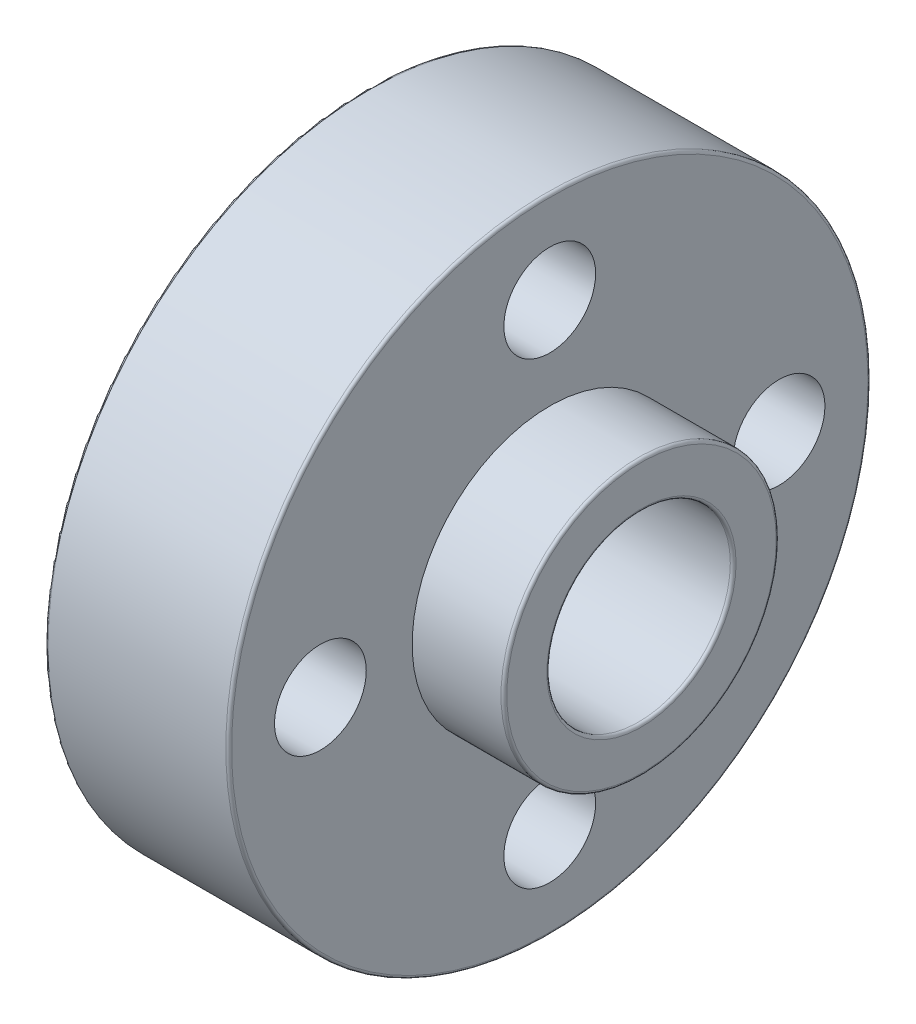
ISO-10303-21;
HEADER;
FILE_DESCRIPTION(('STEP AP214'),'2;1');
FILE_NAME('part.step','',(''),(''),'','','');
FILE_SCHEMA(('AUTOMOTIVE_DESIGN { 1 0 10303 214 1 1 1 1 }'));
ENDSEC;
DATA;
#1=APPLICATION_CONTEXT('core data for automotive mechanical design processes');
#2=APPLICATION_PROTOCOL_DEFINITION('international standard','automotive_design',2000,#1);
#3=PRODUCT_CONTEXT('',#1,'mechanical');
#4=PRODUCT('Part','Part','',(#3));
#5=PRODUCT_RELATED_PRODUCT_CATEGORY('part','',(#4));
#6=PRODUCT_DEFINITION_FORMATION('','',#4);
#7=PRODUCT_DEFINITION_CONTEXT('part definition',#1,'design');
#8=PRODUCT_DEFINITION('design','',#6,#7);
#9=PRODUCT_DEFINITION_SHAPE('','',#8);
#10=(LENGTH_UNIT() NAMED_UNIT(*) SI_UNIT(.MILLI.,.METRE.));
#11=(NAMED_UNIT(*) PLANE_ANGLE_UNIT() SI_UNIT($,.RADIAN.));
#12=(NAMED_UNIT(*) SI_UNIT($,.STERADIAN.) SOLID_ANGLE_UNIT());
#13=UNCERTAINTY_MEASURE_WITH_UNIT(LENGTH_MEASURE(1.E-05),#10,'distance_accuracy_value','');
#14=(GEOMETRIC_REPRESENTATION_CONTEXT(3) GLOBAL_UNCERTAINTY_ASSIGNED_CONTEXT((#13)) GLOBAL_UNIT_ASSIGNED_CONTEXT((#10,
#11,#12)) REPRESENTATION_CONTEXT('',''));
#15=CARTESIAN_POINT('',(0.,0.,0.));
#16=DIRECTION('',(0.,0.,1.));
#17=DIRECTION('',(1.,0.,0.));
#18=AXIS2_PLACEMENT_3D('',#15,#16,#17);
#19=CARTESIAN_POINT('',(-3.175,0.,0.));
#20=DIRECTION('',(1.,0.,0.));
#21=DIRECTION('',(0.,0.,-1.));
#22=AXIS2_PLACEMENT_3D('',#19,#20,#21);
#23=CYLINDRICAL_SURFACE('',#22,11.1125);
#24=CARTESIAN_POINT('',(-0.0999999999999998,0.,0.));
#25=DIRECTION('',(1.,0.,0.));
#26=DIRECTION('',(0.,0.,-1.));
#27=AXIS2_PLACEMENT_3D('',#24,#25,#26);
#28=CIRCLE('',#27,11.1125);
#29=CARTESIAN_POINT('',(-0.0999999999999998,0.,-11.1125));
#30=VERTEX_POINT('',#29);
#31=EDGE_CURVE('E53',#30,#30,#28,.F.);
#32=ORIENTED_EDGE('',*,*,#31,.T.);
#33=EDGE_LOOP('',(#32));
#34=FACE_BOUND('',#33,.T.);
#35=CARTESIAN_POINT('',(-6.25,0.,0.));
#36=DIRECTION('',(-1.,0.,0.));
#37=DIRECTION('',(0.,0.,1.));
#38=AXIS2_PLACEMENT_3D('',#35,#36,#37);
#39=CIRCLE('',#38,11.1125);
#40=CARTESIAN_POINT('',(-6.25,0.,11.1125));
#41=VERTEX_POINT('',#40);
#42=EDGE_CURVE('E56',#41,#41,#39,.F.);
#43=ORIENTED_EDGE('',*,*,#42,.T.);
#44=EDGE_LOOP('',(#43));
#45=FACE_BOUND('',#44,.T.);
#46=ADVANCED_FACE('F33',(#34,#45),#23,.T.);
#47=CARTESIAN_POINT('',(0.,0.,0.));
#48=DIRECTION('',(1.,0.,0.));
#49=DIRECTION('',(0.,0.,-1.));
#50=AXIS2_PLACEMENT_3D('',#47,#48,#49);
#51=PLANE('',#50);
#52=CARTESIAN_POINT('',(0.,0.,0.));
#53=DIRECTION('',(1.,0.,0.));
#54=DIRECTION('',(0.,0.,-1.));
#55=AXIS2_PLACEMENT_3D('',#52,#53,#54);
#56=CIRCLE('',#55,11.0125);
#57=CARTESIAN_POINT('',(0.,0.,-11.0125));
#58=VERTEX_POINT('',#57);
#59=EDGE_CURVE('E59',#58,#58,#56,.T.);
#60=ORIENTED_EDGE('',*,*,#59,.T.);
#61=EDGE_LOOP('',(#60));
#62=FACE_BOUND('',#61,.T.);
#63=CARTESIAN_POINT('',(0.,0.,-7.9375));
#64=DIRECTION('',(1.,0.,0.));
#65=DIRECTION('',(0.,0.,-1.));
#66=AXIS2_PLACEMENT_3D('',#63,#64,#65);
#67=CIRCLE('',#66,1.5875);
#68=CARTESIAN_POINT('',(0.,0.,-9.525));
#69=VERTEX_POINT('',#68);
#70=EDGE_CURVE('E91',#69,#69,#67,.T.);
#71=ORIENTED_EDGE('',*,*,#70,.F.);
#72=EDGE_LOOP('',(#71));
#73=FACE_BOUND('',#72,.T.);
#74=CARTESIAN_POINT('',(0.,-7.9375,0.));
#75=DIRECTION('',(1.,0.,0.));
#76=DIRECTION('',(0.,0.,-1.));
#77=AXIS2_PLACEMENT_3D('',#74,#75,#76);
#78=CIRCLE('',#77,1.5875);
#79=CARTESIAN_POINT('',(0.,-7.9375,-1.58749999999997));
#80=VERTEX_POINT('',#79);
#81=EDGE_CURVE('E102',#80,#80,#78,.T.);
#82=ORIENTED_EDGE('',*,*,#81,.F.);
#83=EDGE_LOOP('',(#82));
#84=FACE_BOUND('',#83,.T.);
#85=CARTESIAN_POINT('',(0.,0.,7.9375));
#86=DIRECTION('',(1.,0.,0.));
#87=DIRECTION('',(0.,0.,-1.));
#88=AXIS2_PLACEMENT_3D('',#85,#86,#87);
#89=CIRCLE('',#88,1.5875);
#90=CARTESIAN_POINT('',(0.,0.,6.35));
#91=VERTEX_POINT('',#90);
#92=EDGE_CURVE('E99',#91,#91,#89,.T.);
#93=ORIENTED_EDGE('',*,*,#92,.F.);
#94=EDGE_LOOP('',(#93));
#95=FACE_BOUND('',#94,.T.);
#96=CARTESIAN_POINT('',(0.,7.9375,0.));
#97=DIRECTION('',(1.,0.,0.));
#98=DIRECTION('',(0.,0.,-1.));
#99=AXIS2_PLACEMENT_3D('',#96,#97,#98);
#100=CIRCLE('',#99,1.5875);
#101=CARTESIAN_POINT('',(0.,7.9375,-1.58750000000008));
#102=VERTEX_POINT('',#101);
#103=EDGE_CURVE('E96',#102,#102,#100,.T.);
#104=ORIENTED_EDGE('',*,*,#103,.F.);
#105=EDGE_LOOP('',(#104));
#106=FACE_BOUND('',#105,.T.);
#107=CARTESIAN_POINT('',(0.,0.,0.));
#108=DIRECTION('',(1.,0.,0.));
#109=DIRECTION('',(0.,0.,-1.));
#110=AXIS2_PLACEMENT_3D('',#107,#108,#109);
#111=CIRCLE('',#110,4.7625);
#112=CARTESIAN_POINT('',(0.,0.,-4.7625));
#113=VERTEX_POINT('',#112);
#114=EDGE_CURVE('E77',#113,#113,#111,.T.);
#115=ORIENTED_EDGE('',*,*,#114,.F.);
#116=EDGE_LOOP('',(#115));
#117=FACE_BOUND('',#116,.T.);
#118=ADVANCED_FACE('F110',(#62,#73,#84,#95,#106,#117),#51,.T.);
#119=CARTESIAN_POINT('',(3.175,0.,0.));
#120=DIRECTION('',(-1.,0.,0.));
#121=DIRECTION('',(0.,0.,1.));
#122=AXIS2_PLACEMENT_3D('',#119,#120,#121);
#123=CYLINDRICAL_SURFACE('',#122,4.7625);
#124=CARTESIAN_POINT('',(3.075,0.,0.));
#125=DIRECTION('',(1.,0.,0.));
#126=DIRECTION('',(0.,0.,-1.));
#127=AXIS2_PLACEMENT_3D('',#124,#125,#126);
#128=CIRCLE('',#127,4.7625);
#129=CARTESIAN_POINT('',(3.075,0.,-4.7625));
#130=VERTEX_POINT('',#129);
#131=EDGE_CURVE('E62',#130,#130,#128,.F.);
#132=ORIENTED_EDGE('',*,*,#131,.T.);
#133=EDGE_LOOP('',(#132));
#134=FACE_BOUND('',#133,.T.);
#135=ORIENTED_EDGE('',*,*,#114,.T.);
#136=EDGE_LOOP('',(#135));
#137=FACE_BOUND('',#136,.T.);
#138=ADVANCED_FACE('F113',(#134,#137),#123,.T.);
#139=CARTESIAN_POINT('',(3.175,0.,0.));
#140=DIRECTION('',(1.,0.,0.));
#141=DIRECTION('',(0.,0.,-1.));
#142=AXIS2_PLACEMENT_3D('',#139,#140,#141);
#143=PLANE('',#142);
#144=CARTESIAN_POINT('',(3.175,0.,0.));
#145=DIRECTION('',(1.,0.,0.));
#146=DIRECTION('',(0.,0.,-1.));
#147=AXIS2_PLACEMENT_3D('',#144,#145,#146);
#148=CIRCLE('',#147,3.275);
#149=CARTESIAN_POINT('',(3.175,0.,-3.275));
#150=VERTEX_POINT('',#149);
#151=EDGE_CURVE('E65',#150,#150,#148,.F.);
#152=ORIENTED_EDGE('',*,*,#151,.T.);
#153=EDGE_LOOP('',(#152));
#154=FACE_BOUND('',#153,.T.);
#155=CARTESIAN_POINT('',(3.175,0.,0.));
#156=DIRECTION('',(1.,0.,0.));
#157=DIRECTION('',(0.,0.,-1.));
#158=AXIS2_PLACEMENT_3D('',#155,#156,#157);
#159=CIRCLE('',#158,4.6625);
#160=CARTESIAN_POINT('',(3.175,0.,-4.6625));
#161=VERTEX_POINT('',#160);
#162=EDGE_CURVE('E68',#161,#161,#159,.T.);
#163=ORIENTED_EDGE('',*,*,#162,.T.);
#164=EDGE_LOOP('',(#163));
#165=FACE_BOUND('',#164,.T.);
#166=ADVANCED_FACE('F125',(#154,#165),#143,.T.);
#167=CARTESIAN_POINT('',(-3.175,0.,0.));
#168=DIRECTION('',(1.,0.,0.));
#169=DIRECTION('',(0.,0.,-1.));
#170=AXIS2_PLACEMENT_3D('',#167,#168,#169);
#171=CYLINDRICAL_SURFACE('',#170,3.175);
#172=CARTESIAN_POINT('',(3.075,0.,0.));
#173=DIRECTION('',(1.,0.,0.));
#174=DIRECTION('',(0.,0.,-1.));
#175=AXIS2_PLACEMENT_3D('',#172,#173,#174);
#176=CIRCLE('',#175,3.175);
#177=CARTESIAN_POINT('',(3.075,0.,-3.175));
#178=VERTEX_POINT('',#177);
#179=EDGE_CURVE('E71',#178,#178,#176,.T.);
#180=ORIENTED_EDGE('',*,*,#179,.T.);
#181=EDGE_LOOP('',(#180));
#182=FACE_BOUND('',#181,.T.);
#183=CARTESIAN_POINT('',(-9.425,0.,0.));
#184=DIRECTION('',(-1.,0.,0.));
#185=DIRECTION('',(0.,0.,1.));
#186=AXIS2_PLACEMENT_3D('',#183,#184,#185);
#187=CIRCLE('',#186,3.175);
#188=CARTESIAN_POINT('',(-9.425,0.,3.175));
#189=VERTEX_POINT('',#188);
#190=EDGE_CURVE('E74',#189,#189,#187,.T.);
#191=ORIENTED_EDGE('',*,*,#190,.T.);
#192=EDGE_LOOP('',(#191));
#193=FACE_BOUND('',#192,.T.);
#194=ADVANCED_FACE('F131',(#182,#193),#171,.F.);
#195=CARTESIAN_POINT('',(-6.35,0.,0.));
#196=DIRECTION('',(-1.,0.,0.));
#197=DIRECTION('',(0.,0.,-1.));
#198=AXIS2_PLACEMENT_3D('',#195,#196,#197);
#199=PLANE('',#198);
#200=CARTESIAN_POINT('',(-6.35,0.,0.));
#201=DIRECTION('',(-1.,0.,0.));
#202=DIRECTION('',(0.,0.,1.));
#203=AXIS2_PLACEMENT_3D('',#200,#201,#202);
#204=CIRCLE('',#203,11.0125);
#205=CARTESIAN_POINT('',(-6.35,0.,11.0125));
#206=VERTEX_POINT('',#205);
#207=EDGE_CURVE('E10',#206,#206,#204,.T.);
#208=ORIENTED_EDGE('',*,*,#207,.T.);
#209=EDGE_LOOP('',(#208));
#210=FACE_BOUND('',#209,.T.);
#211=CARTESIAN_POINT('',(-6.35,0.,-7.9375));
#212=DIRECTION('',(-1.,0.,0.));
#213=DIRECTION('',(0.,0.,1.));
#214=AXIS2_PLACEMENT_3D('',#211,#212,#213);
#215=CIRCLE('',#214,1.5875);
#216=CARTESIAN_POINT('',(-6.35,0.,-6.35));
#217=VERTEX_POINT('',#216);
#218=EDGE_CURVE('E78',#217,#217,#215,.T.);
#219=ORIENTED_EDGE('',*,*,#218,.F.);
#220=EDGE_LOOP('',(#219));
#221=FACE_BOUND('',#220,.T.);
#222=CARTESIAN_POINT('',(-6.35,-7.9375,0.));
#223=DIRECTION('',(-1.,0.,0.));
#224=DIRECTION('',(0.,0.,1.));
#225=AXIS2_PLACEMENT_3D('',#222,#223,#224);
#226=CIRCLE('',#225,1.5875);
#227=CARTESIAN_POINT('',(-6.35,-7.9375,1.58750000000003));
#228=VERTEX_POINT('',#227);
#229=EDGE_CURVE('E82',#228,#228,#226,.T.);
#230=ORIENTED_EDGE('',*,*,#229,.F.);
#231=EDGE_LOOP('',(#230));
#232=FACE_BOUND('',#231,.T.);
#233=CARTESIAN_POINT('',(-6.35,0.,7.9375));
#234=DIRECTION('',(-1.,0.,0.));
#235=DIRECTION('',(0.,0.,1.));
#236=AXIS2_PLACEMENT_3D('',#233,#234,#235);
#237=CIRCLE('',#236,1.5875);
#238=CARTESIAN_POINT('',(-6.35,0.,9.525));
#239=VERTEX_POINT('',#238);
#240=EDGE_CURVE('E85',#239,#239,#237,.T.);
#241=ORIENTED_EDGE('',*,*,#240,.F.);
#242=EDGE_LOOP('',(#241));
#243=FACE_BOUND('',#242,.T.);
#244=CARTESIAN_POINT('',(-6.35,7.9375,0.));
#245=DIRECTION('',(-1.,0.,0.));
#246=DIRECTION('',(0.,0.,1.));
#247=AXIS2_PLACEMENT_3D('',#244,#245,#246);
#248=CIRCLE('',#247,1.5875);
#249=CARTESIAN_POINT('',(-6.35,7.9375,1.58749999999992));
#250=VERTEX_POINT('',#249);
#251=EDGE_CURVE('E88',#250,#250,#248,.T.);
#252=ORIENTED_EDGE('',*,*,#251,.F.);
#253=EDGE_LOOP('',(#252));
#254=FACE_BOUND('',#253,.T.);
#255=CARTESIAN_POINT('',(-6.35,0.,0.));
#256=DIRECTION('',(1.,0.,0.));
#257=DIRECTION('',(0.,0.,-1.));
#258=AXIS2_PLACEMENT_3D('',#255,#256,#257);
#259=CIRCLE('',#258,4.7625);
#260=CARTESIAN_POINT('',(-6.35,0.,-4.7625));
#261=VERTEX_POINT('',#260);
#262=EDGE_CURVE('E81',#261,#261,#259,.T.);
#263=ORIENTED_EDGE('',*,*,#262,.T.);
#264=EDGE_LOOP('',(#263));
#265=FACE_BOUND('',#264,.T.);
#266=ADVANCED_FACE('F179',(#210,#221,#232,#243,#254,#265),#199,.T.);
#267=CARTESIAN_POINT('',(-9.525,0.,0.));
#268=DIRECTION('',(1.,0.,0.));
#269=DIRECTION('',(0.,0.,-1.));
#270=AXIS2_PLACEMENT_3D('',#267,#268,#269);
#271=CYLINDRICAL_SURFACE('',#270,4.7625);
#272=CARTESIAN_POINT('',(-9.425,0.,0.));
#273=DIRECTION('',(-1.,0.,0.));
#274=DIRECTION('',(0.,0.,1.));
#275=AXIS2_PLACEMENT_3D('',#272,#273,#274);
#276=CIRCLE('',#275,4.7625);
#277=CARTESIAN_POINT('',(-9.425,0.,4.7625));
#278=VERTEX_POINT('',#277);
#279=EDGE_CURVE('E40',#278,#278,#276,.F.);
#280=ORIENTED_EDGE('',*,*,#279,.T.);
#281=EDGE_LOOP('',(#280));
#282=FACE_BOUND('',#281,.T.);
#283=ORIENTED_EDGE('',*,*,#262,.F.);
#284=EDGE_LOOP('',(#283));
#285=FACE_BOUND('',#284,.T.);
#286=ADVANCED_FACE('F169',(#282,#285),#271,.T.);
#287=CARTESIAN_POINT('',(-9.525,0.,0.));
#288=DIRECTION('',(-1.,0.,0.));
#289=DIRECTION('',(0.,0.,-1.));
#290=AXIS2_PLACEMENT_3D('',#287,#288,#289);
#291=PLANE('',#290);
#292=CARTESIAN_POINT('',(-9.525,0.,0.));
#293=DIRECTION('',(-1.,0.,0.));
#294=DIRECTION('',(0.,0.,1.));
#295=AXIS2_PLACEMENT_3D('',#292,#293,#294);
#296=CIRCLE('',#295,3.275);
#297=CARTESIAN_POINT('',(-9.525,0.,3.275));
#298=VERTEX_POINT('',#297);
#299=EDGE_CURVE('E44',#298,#298,#296,.F.);
#300=ORIENTED_EDGE('',*,*,#299,.T.);
#301=EDGE_LOOP('',(#300));
#302=FACE_BOUND('',#301,.T.);
#303=CARTESIAN_POINT('',(-9.525,0.,0.));
#304=DIRECTION('',(-1.,0.,0.));
#305=DIRECTION('',(0.,0.,1.));
#306=AXIS2_PLACEMENT_3D('',#303,#304,#305);
#307=CIRCLE('',#306,4.6625);
#308=CARTESIAN_POINT('',(-9.525,0.,4.6625));
#309=VERTEX_POINT('',#308);
#310=EDGE_CURVE('E48',#309,#309,#307,.T.);
#311=ORIENTED_EDGE('',*,*,#310,.T.);
#312=EDGE_LOOP('',(#311));
#313=FACE_BOUND('',#312,.T.);
#314=ADVANCED_FACE('F166',(#302,#313),#291,.T.);
#315=CARTESIAN_POINT('',(-9.525,7.9375,0.));
#316=DIRECTION('',(1.,0.,0.));
#317=DIRECTION('',(0.,0.,-1.));
#318=AXIS2_PLACEMENT_3D('',#315,#316,#317);
#319=CYLINDRICAL_SURFACE('',#318,1.5875);
#320=ORIENTED_EDGE('',*,*,#251,.T.);
#321=EDGE_LOOP('',(#320));
#322=FACE_BOUND('',#321,.T.);
#323=ORIENTED_EDGE('',*,*,#103,.T.);
#324=EDGE_LOOP('',(#323));
#325=FACE_BOUND('',#324,.T.);
#326=ADVANCED_FACE('F168',(#322,#325),#319,.F.);
#327=CARTESIAN_POINT('',(-9.525,0.,7.9375));
#328=DIRECTION('',(1.,0.,0.));
#329=DIRECTION('',(0.,0.,-1.));
#330=AXIS2_PLACEMENT_3D('',#327,#328,#329);
#331=CYLINDRICAL_SURFACE('',#330,1.5875);
#332=ORIENTED_EDGE('',*,*,#240,.T.);
#333=EDGE_LOOP('',(#332));
#334=FACE_BOUND('',#333,.T.);
#335=ORIENTED_EDGE('',*,*,#92,.T.);
#336=EDGE_LOOP('',(#335));
#337=FACE_BOUND('',#336,.T.);
#338=ADVANCED_FACE('F176',(#334,#337),#331,.F.);
#339=CARTESIAN_POINT('',(-9.525,-7.9375,0.));
#340=DIRECTION('',(1.,0.,0.));
#341=DIRECTION('',(0.,0.,-1.));
#342=AXIS2_PLACEMENT_3D('',#339,#340,#341);
#343=CYLINDRICAL_SURFACE('',#342,1.5875);
#344=ORIENTED_EDGE('',*,*,#229,.T.);
#345=EDGE_LOOP('',(#344));
#346=FACE_BOUND('',#345,.T.);
#347=ORIENTED_EDGE('',*,*,#81,.T.);
#348=EDGE_LOOP('',(#347));
#349=FACE_BOUND('',#348,.T.);
#350=ADVANCED_FACE('F252',(#346,#349),#343,.F.);
#351=CARTESIAN_POINT('',(-9.525,0.,-7.9375));
#352=DIRECTION('',(1.,0.,0.));
#353=DIRECTION('',(0.,0.,-1.));
#354=AXIS2_PLACEMENT_3D('',#351,#352,#353);
#355=CYLINDRICAL_SURFACE('',#354,1.5875);
#356=ORIENTED_EDGE('',*,*,#218,.T.);
#357=EDGE_LOOP('',(#356));
#358=FACE_BOUND('',#357,.T.);
#359=ORIENTED_EDGE('',*,*,#70,.T.);
#360=EDGE_LOOP('',(#359));
#361=FACE_BOUND('',#360,.T.);
#362=ADVANCED_FACE('F108',(#358,#361),#355,.F.);
#363=CARTESIAN_POINT('',(3.075,0.,0.));
#364=DIRECTION('',(1.,0.,0.));
#365=DIRECTION('',(0.,0.,-1.));
#366=AXIS2_PLACEMENT_3D('',#363,#364,#365);
#367=TOROIDAL_SURFACE('',#366,3.275,0.1);
#368=ORIENTED_EDGE('',*,*,#151,.F.);
#369=EDGE_LOOP('',(#368));
#370=FACE_BOUND('',#369,.T.);
#371=ORIENTED_EDGE('',*,*,#179,.F.);
#372=EDGE_LOOP('',(#371));
#373=FACE_BOUND('',#372,.T.);
#374=ADVANCED_FACE('F141',(#370,#373),#367,.T.);
#375=CARTESIAN_POINT('',(3.075,0.,0.));
#376=DIRECTION('',(1.,0.,0.));
#377=DIRECTION('',(0.,0.,-1.));
#378=AXIS2_PLACEMENT_3D('',#375,#376,#377);
#379=TOROIDAL_SURFACE('',#378,4.6625,0.1);
#380=ORIENTED_EDGE('',*,*,#131,.F.);
#381=EDGE_LOOP('',(#380));
#382=FACE_BOUND('',#381,.T.);
#383=ORIENTED_EDGE('',*,*,#162,.F.);
#384=EDGE_LOOP('',(#383));
#385=FACE_BOUND('',#384,.T.);
#386=ADVANCED_FACE('F144',(#382,#385),#379,.T.);
#387=CARTESIAN_POINT('',(-0.0999999999999998,0.,0.));
#388=DIRECTION('',(1.,0.,0.));
#389=DIRECTION('',(0.,0.,-1.));
#390=AXIS2_PLACEMENT_3D('',#387,#388,#389);
#391=TOROIDAL_SURFACE('',#390,11.0125,0.1);
#392=ORIENTED_EDGE('',*,*,#31,.F.);
#393=EDGE_LOOP('',(#392));
#394=FACE_BOUND('',#393,.T.);
#395=ORIENTED_EDGE('',*,*,#59,.F.);
#396=EDGE_LOOP('',(#395));
#397=FACE_BOUND('',#396,.T.);
#398=ADVANCED_FACE('F148',(#394,#397),#391,.T.);
#399=CARTESIAN_POINT('',(-9.425,0.,0.));
#400=DIRECTION('',(-1.,0.,0.));
#401=DIRECTION('',(0.,0.,1.));
#402=AXIS2_PLACEMENT_3D('',#399,#400,#401);
#403=TOROIDAL_SURFACE('',#402,3.275,0.1);
#404=ORIENTED_EDGE('',*,*,#190,.F.);
#405=EDGE_LOOP('',(#404));
#406=FACE_BOUND('',#405,.T.);
#407=ORIENTED_EDGE('',*,*,#299,.F.);
#408=EDGE_LOOP('',(#407));
#409=FACE_BOUND('',#408,.T.);
#410=ADVANCED_FACE('F152',(#406,#409),#403,.T.);
#411=CARTESIAN_POINT('',(-9.425,0.,0.));
#412=DIRECTION('',(-1.,0.,0.));
#413=DIRECTION('',(0.,0.,1.));
#414=AXIS2_PLACEMENT_3D('',#411,#412,#413);
#415=TOROIDAL_SURFACE('',#414,4.6625,0.1);
#416=ORIENTED_EDGE('',*,*,#310,.F.);
#417=EDGE_LOOP('',(#416));
#418=FACE_BOUND('',#417,.T.);
#419=ORIENTED_EDGE('',*,*,#279,.F.);
#420=EDGE_LOOP('',(#419));
#421=FACE_BOUND('',#420,.T.);
#422=ADVANCED_FACE('F155',(#418,#421),#415,.T.);
#423=CARTESIAN_POINT('',(-6.25,0.,0.));
#424=DIRECTION('',(-1.,0.,0.));
#425=DIRECTION('',(0.,0.,1.));
#426=AXIS2_PLACEMENT_3D('',#423,#424,#425);
#427=TOROIDAL_SURFACE('',#426,11.0125,0.1);
#428=ORIENTED_EDGE('',*,*,#207,.F.);
#429=EDGE_LOOP('',(#428));
#430=FACE_BOUND('',#429,.T.);
#431=ORIENTED_EDGE('',*,*,#42,.F.);
#432=EDGE_LOOP('',(#431));
#433=FACE_BOUND('',#432,.T.);
#434=ADVANCED_FACE('F35',(#430,#433),#427,.T.);
#435=CLOSED_SHELL('',(#46,#118,#138,#166,#194,#266,#286,#314,#326,#338,#350,#362,#374,#386,#398,
#410,#422,#434));
#436=MANIFOLD_SOLID_BREP('B2',#435);
#437=ADVANCED_BREP_SHAPE_REPRESENTATION('',(#18,#436),#14);
#438=SHAPE_DEFINITION_REPRESENTATION(#9,#437);
ENDSEC;
END-ISO-10303-21;
